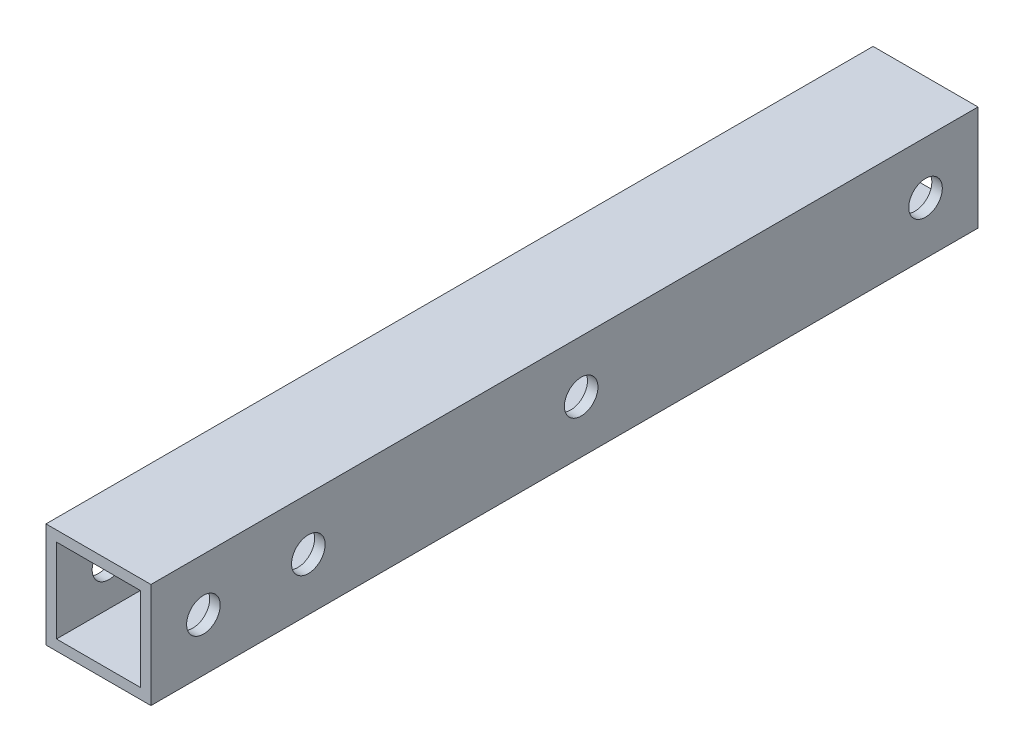
ISO-10303-21;
HEADER;
FILE_DESCRIPTION(('STEP AP214'),'2;1');
FILE_NAME('part.step','',(''),(''),'','','');
FILE_SCHEMA(('AUTOMOTIVE_DESIGN { 1 0 10303 214 1 1 1 1 }'));
ENDSEC;
DATA;
#1=APPLICATION_CONTEXT('core data for automotive mechanical design processes');
#2=APPLICATION_PROTOCOL_DEFINITION('international standard','automotive_design',2000,#1);
#3=PRODUCT_CONTEXT('',#1,'mechanical');
#4=PRODUCT('Part','Part','',(#3));
#5=PRODUCT_RELATED_PRODUCT_CATEGORY('part','',(#4));
#6=PRODUCT_DEFINITION_FORMATION('','',#4);
#7=PRODUCT_DEFINITION_CONTEXT('part definition',#1,'design');
#8=PRODUCT_DEFINITION('design','',#6,#7);
#9=PRODUCT_DEFINITION_SHAPE('','',#8);
#10=(LENGTH_UNIT() NAMED_UNIT(*) SI_UNIT(.MILLI.,.METRE.));
#11=(NAMED_UNIT(*) PLANE_ANGLE_UNIT() SI_UNIT($,.RADIAN.));
#12=(NAMED_UNIT(*) SI_UNIT($,.STERADIAN.) SOLID_ANGLE_UNIT());
#13=UNCERTAINTY_MEASURE_WITH_UNIT(LENGTH_MEASURE(1.E-05),#10,'distance_accuracy_value','');
#14=(GEOMETRIC_REPRESENTATION_CONTEXT(3) GLOBAL_UNCERTAINTY_ASSIGNED_CONTEXT((#13)) GLOBAL_UNIT_ASSIGNED_CONTEXT((#10,
#11,#12)) REPRESENTATION_CONTEXT('',''));
#15=CARTESIAN_POINT('',(0.,0.,0.));
#16=DIRECTION('',(0.,0.,1.));
#17=DIRECTION('',(1.,0.,0.));
#18=AXIS2_PLACEMENT_3D('',#15,#16,#17);
#19=CARTESIAN_POINT('',(0.,0.,78.81860214));
#20=DIRECTION('',(0.,0.,-1.));
#21=DIRECTION('',(-1.,0.,0.));
#22=AXIS2_PLACEMENT_3D('',#19,#20,#21);
#23=PLANE('',#22);
#24=DIRECTION('',(0.,1.,0.));
#25=VECTOR('',#24,1.);
#26=CARTESIAN_POINT('',(5.,-5.,78.81860214));
#27=LINE('',#26,#25);
#28=CARTESIAN_POINT('',(5.,-5.,78.81860214));
#29=VERTEX_POINT('',#28);
#30=CARTESIAN_POINT('',(5.,5.,78.81860214));
#31=VERTEX_POINT('',#30);
#32=EDGE_CURVE('E138',#29,#31,#27,.T.);
#33=ORIENTED_EDGE('',*,*,#32,.T.);
#34=DIRECTION('',(-1.,0.,0.));
#35=VECTOR('',#34,1.);
#36=CARTESIAN_POINT('',(-5.,5.,78.81860214));
#37=LINE('',#36,#35);
#38=CARTESIAN_POINT('',(-5.,5.,78.81860214));
#39=VERTEX_POINT('',#38);
#40=EDGE_CURVE('E141',#31,#39,#37,.T.);
#41=ORIENTED_EDGE('',*,*,#40,.T.);
#42=DIRECTION('',(0.,-1.,0.));
#43=VECTOR('',#42,1.);
#44=CARTESIAN_POINT('',(-5.,-5.,78.81860214));
#45=LINE('',#44,#43);
#46=CARTESIAN_POINT('',(-5.,-5.,78.81860214));
#47=VERTEX_POINT('',#46);
#48=EDGE_CURVE('E144',#39,#47,#45,.T.);
#49=ORIENTED_EDGE('',*,*,#48,.T.);
#50=DIRECTION('',(1.,0.,0.));
#51=VECTOR('',#50,1.);
#52=CARTESIAN_POINT('',(-5.,-5.,78.81860214));
#53=LINE('',#52,#51);
#54=EDGE_CURVE('E146',#47,#29,#53,.T.);
#55=ORIENTED_EDGE('',*,*,#54,.T.);
#56=EDGE_LOOP('',(#33,#41,#49,#55));
#57=FACE_BOUND('',#56,.T.);
#58=DIRECTION('',(0.,1.,0.));
#59=VECTOR('',#58,1.);
#60=CARTESIAN_POINT('',(4.,-4.,78.81860214));
#61=LINE('',#60,#59);
#62=CARTESIAN_POINT('',(4.,-4.,78.81860214));
#63=VERTEX_POINT('',#62);
#64=CARTESIAN_POINT('',(4.,4.,78.81860214));
#65=VERTEX_POINT('',#64);
#66=EDGE_CURVE('E100',#63,#65,#61,.T.);
#67=ORIENTED_EDGE('',*,*,#66,.F.);
#68=DIRECTION('',(1.,0.,0.));
#69=VECTOR('',#68,1.);
#70=CARTESIAN_POINT('',(-4.,-4.,78.81860214));
#71=LINE('',#70,#69);
#72=CARTESIAN_POINT('',(-4.,-4.,78.81860214));
#73=VERTEX_POINT('',#72);
#74=EDGE_CURVE('E122',#73,#63,#71,.T.);
#75=ORIENTED_EDGE('',*,*,#74,.F.);
#76=DIRECTION('',(0.,-1.,0.));
#77=VECTOR('',#76,1.);
#78=CARTESIAN_POINT('',(-4.,-4.,78.81860214));
#79=LINE('',#78,#77);
#80=CARTESIAN_POINT('',(-4.,4.,78.81860214));
#81=VERTEX_POINT('',#80);
#82=EDGE_CURVE('E120',#81,#73,#79,.T.);
#83=ORIENTED_EDGE('',*,*,#82,.F.);
#84=DIRECTION('',(-1.,0.,0.));
#85=VECTOR('',#84,1.);
#86=CARTESIAN_POINT('',(-4.,4.,78.81860214));
#87=LINE('',#86,#85);
#88=EDGE_CURVE('E108',#65,#81,#87,.T.);
#89=ORIENTED_EDGE('',*,*,#88,.F.);
#90=EDGE_LOOP('',(#67,#75,#83,#89));
#91=FACE_BOUND('',#90,.T.);
#92=ADVANCED_FACE('F33',(#57,#91),#23,.F.);
#93=CARTESIAN_POINT('',(0.,0.,0.));
#94=DIRECTION('',(0.,0.,-1.));
#95=DIRECTION('',(-1.,0.,0.));
#96=AXIS2_PLACEMENT_3D('',#93,#94,#95);
#97=PLANE('',#96);
#98=DIRECTION('',(0.,1.,0.));
#99=VECTOR('',#98,1.);
#100=CARTESIAN_POINT('',(5.,-5.,0.));
#101=LINE('',#100,#99);
#102=CARTESIAN_POINT('',(5.,-5.,0.));
#103=VERTEX_POINT('',#102);
#104=CARTESIAN_POINT('',(5.,5.,0.));
#105=VERTEX_POINT('',#104);
#106=EDGE_CURVE('E116',#103,#105,#101,.T.);
#107=ORIENTED_EDGE('',*,*,#106,.F.);
#108=DIRECTION('',(1.,0.,0.));
#109=VECTOR('',#108,1.);
#110=CARTESIAN_POINT('',(-5.,-5.,0.));
#111=LINE('',#110,#109);
#112=CARTESIAN_POINT('',(-5.,-5.,0.));
#113=VERTEX_POINT('',#112);
#114=EDGE_CURVE('E142',#113,#103,#111,.T.);
#115=ORIENTED_EDGE('',*,*,#114,.F.);
#116=DIRECTION('',(0.,-1.,0.));
#117=VECTOR('',#116,1.);
#118=CARTESIAN_POINT('',(-5.,-5.,0.));
#119=LINE('',#118,#117);
#120=CARTESIAN_POINT('',(-5.,5.,0.));
#121=VERTEX_POINT('',#120);
#122=EDGE_CURVE('E153',#121,#113,#119,.T.);
#123=ORIENTED_EDGE('',*,*,#122,.F.);
#124=DIRECTION('',(-1.,0.,0.));
#125=VECTOR('',#124,1.);
#126=CARTESIAN_POINT('',(-5.,5.,0.));
#127=LINE('',#126,#125);
#128=EDGE_CURVE('E151',#105,#121,#127,.T.);
#129=ORIENTED_EDGE('',*,*,#128,.F.);
#130=EDGE_LOOP('',(#107,#115,#123,#129));
#131=FACE_BOUND('',#130,.T.);
#132=DIRECTION('',(1.,0.,0.));
#133=VECTOR('',#132,1.);
#134=CARTESIAN_POINT('',(-4.,-4.,0.));
#135=LINE('',#134,#133);
#136=CARTESIAN_POINT('',(-4.,-4.,0.));
#137=VERTEX_POINT('',#136);
#138=CARTESIAN_POINT('',(4.,-4.,0.));
#139=VERTEX_POINT('',#138);
#140=EDGE_CURVE('E109',#137,#139,#135,.T.);
#141=ORIENTED_EDGE('',*,*,#140,.T.);
#142=DIRECTION('',(0.,1.,0.));
#143=VECTOR('',#142,1.);
#144=CARTESIAN_POINT('',(4.,-4.,0.));
#145=LINE('',#144,#143);
#146=CARTESIAN_POINT('',(4.,4.,0.));
#147=VERTEX_POINT('',#146);
#148=EDGE_CURVE('E58',#139,#147,#145,.T.);
#149=ORIENTED_EDGE('',*,*,#148,.T.);
#150=DIRECTION('',(-1.,0.,0.));
#151=VECTOR('',#150,1.);
#152=CARTESIAN_POINT('',(-4.,4.,0.));
#153=LINE('',#152,#151);
#154=CARTESIAN_POINT('',(-4.,4.,0.));
#155=VERTEX_POINT('',#154);
#156=EDGE_CURVE('E115',#147,#155,#153,.T.);
#157=ORIENTED_EDGE('',*,*,#156,.T.);
#158=DIRECTION('',(0.,-1.,0.));
#159=VECTOR('',#158,1.);
#160=CARTESIAN_POINT('',(-4.,-4.,0.));
#161=LINE('',#160,#159);
#162=EDGE_CURVE('E130',#155,#137,#161,.T.);
#163=ORIENTED_EDGE('',*,*,#162,.T.);
#164=EDGE_LOOP('',(#141,#149,#157,#163));
#165=FACE_BOUND('',#164,.T.);
#166=ADVANCED_FACE('F231',(#131,#165),#97,.T.);
#167=CARTESIAN_POINT('',(5.,-5.,78.81860214));
#168=DIRECTION('',(-1.,0.,0.));
#169=DIRECTION('',(0.,0.,1.));
#170=AXIS2_PLACEMENT_3D('',#167,#168,#169);
#171=PLANE('',#170);
#172=CARTESIAN_POINT('',(5.,0.,63.81860214));
#173=DIRECTION('',(-1.,0.,0.));
#174=DIRECTION('',(0.,0.,1.));
#175=AXIS2_PLACEMENT_3D('',#172,#173,#174);
#176=CIRCLE('',#175,1.60000000000001);
#177=CARTESIAN_POINT('',(5.,0.,65.41860214));
#178=VERTEX_POINT('',#177);
#179=EDGE_CURVE('E173',#178,#178,#176,.T.);
#180=ORIENTED_EDGE('',*,*,#179,.T.);
#181=EDGE_LOOP('',(#180));
#182=FACE_BOUND('',#181,.T.);
#183=CARTESIAN_POINT('',(5.,0.,37.81860214));
#184=DIRECTION('',(-1.,0.,0.));
#185=DIRECTION('',(0.,0.,1.));
#186=AXIS2_PLACEMENT_3D('',#183,#184,#185);
#187=CIRCLE('',#186,1.60000000000001);
#188=CARTESIAN_POINT('',(5.,0.,39.41860214));
#189=VERTEX_POINT('',#188);
#190=EDGE_CURVE('E184',#189,#189,#187,.T.);
#191=ORIENTED_EDGE('',*,*,#190,.T.);
#192=EDGE_LOOP('',(#191));
#193=FACE_BOUND('',#192,.T.);
#194=CARTESIAN_POINT('',(5.,0.,5.00000000000001));
#195=DIRECTION('',(1.,0.,0.));
#196=DIRECTION('',(0.,0.,-1.));
#197=AXIS2_PLACEMENT_3D('',#194,#195,#196);
#198=CIRCLE('',#197,1.6);
#199=CARTESIAN_POINT('',(5.,0.,3.40000000000001));
#200=VERTEX_POINT('',#199);
#201=EDGE_CURVE('E198',#200,#200,#198,.T.);
#202=ORIENTED_EDGE('',*,*,#201,.F.);
#203=EDGE_LOOP('',(#202));
#204=FACE_BOUND('',#203,.T.);
#205=CARTESIAN_POINT('',(5.,0.,73.81860214));
#206=DIRECTION('',(1.,0.,0.));
#207=DIRECTION('',(0.,0.,-1.));
#208=AXIS2_PLACEMENT_3D('',#205,#206,#207);
#209=CIRCLE('',#208,1.60000000000001);
#210=CARTESIAN_POINT('',(5.,0.,72.21860214));
#211=VERTEX_POINT('',#210);
#212=EDGE_CURVE('E195',#211,#211,#209,.T.);
#213=ORIENTED_EDGE('',*,*,#212,.F.);
#214=EDGE_LOOP('',(#213));
#215=FACE_BOUND('',#214,.T.);
#216=ORIENTED_EDGE('',*,*,#106,.T.);
#217=DIRECTION('',(0.,0.,-1.));
#218=VECTOR('',#217,1.);
#219=CARTESIAN_POINT('',(5.,5.,78.81860214));
#220=LINE('',#219,#218);
#221=EDGE_CURVE('E11',#31,#105,#220,.T.);
#222=ORIENTED_EDGE('',*,*,#221,.F.);
#223=ORIENTED_EDGE('',*,*,#32,.F.);
#224=DIRECTION('',(0.,0.,-1.));
#225=VECTOR('',#224,1.);
#226=CARTESIAN_POINT('',(5.,-5.,78.81860214));
#227=LINE('',#226,#225);
#228=EDGE_CURVE('E148',#29,#103,#227,.T.);
#229=ORIENTED_EDGE('',*,*,#228,.T.);
#230=EDGE_LOOP('',(#216,#222,#223,#229));
#231=FACE_BOUND('',#230,.T.);
#232=ADVANCED_FACE('F35',(#182,#193,#204,#215,#231),#171,.F.);
#233=CARTESIAN_POINT('',(-5.,5.,78.81860214));
#234=DIRECTION('',(0.,-1.,0.));
#235=DIRECTION('',(0.,0.,-1.));
#236=AXIS2_PLACEMENT_3D('',#233,#234,#235);
#237=PLANE('',#236);
#238=ORIENTED_EDGE('',*,*,#128,.T.);
#239=DIRECTION('',(0.,0.,-1.));
#240=VECTOR('',#239,1.);
#241=CARTESIAN_POINT('',(-5.,5.,78.81860214));
#242=LINE('',#241,#240);
#243=EDGE_CURVE('E42',#39,#121,#242,.T.);
#244=ORIENTED_EDGE('',*,*,#243,.F.);
#245=ORIENTED_EDGE('',*,*,#40,.F.);
#246=ORIENTED_EDGE('',*,*,#221,.T.);
#247=EDGE_LOOP('',(#238,#244,#245,#246));
#248=FACE_BOUND('',#247,.T.);
#249=ADVANCED_FACE('F230',(#248),#237,.F.);
#250=CARTESIAN_POINT('',(-5.,-5.,78.81860214));
#251=DIRECTION('',(1.,0.,0.));
#252=DIRECTION('',(0.,0.,-1.));
#253=AXIS2_PLACEMENT_3D('',#250,#251,#252);
#254=PLANE('',#253);
#255=CARTESIAN_POINT('',(-5.,0.,63.81860214));
#256=DIRECTION('',(-1.,0.,0.));
#257=DIRECTION('',(0.,0.,1.));
#258=AXIS2_PLACEMENT_3D('',#255,#256,#257);
#259=CIRCLE('',#258,1.60000000000001);
#260=CARTESIAN_POINT('',(-5.,0.,65.41860214));
#261=VERTEX_POINT('',#260);
#262=EDGE_CURVE('E179',#261,#261,#259,.T.);
#263=ORIENTED_EDGE('',*,*,#262,.F.);
#264=EDGE_LOOP('',(#263));
#265=FACE_BOUND('',#264,.T.);
#266=CARTESIAN_POINT('',(-5.,0.,37.81860214));
#267=DIRECTION('',(-1.,0.,0.));
#268=DIRECTION('',(0.,0.,1.));
#269=AXIS2_PLACEMENT_3D('',#266,#267,#268);
#270=CIRCLE('',#269,1.60000000000001);
#271=CARTESIAN_POINT('',(-5.,0.,39.41860214));
#272=VERTEX_POINT('',#271);
#273=EDGE_CURVE('E189',#272,#272,#270,.T.);
#274=ORIENTED_EDGE('',*,*,#273,.F.);
#275=EDGE_LOOP('',(#274));
#276=FACE_BOUND('',#275,.T.);
#277=CARTESIAN_POINT('',(-5.,0.,5.00000000000001));
#278=DIRECTION('',(1.,0.,0.));
#279=DIRECTION('',(0.,0.,-1.));
#280=AXIS2_PLACEMENT_3D('',#277,#278,#279);
#281=CIRCLE('',#280,1.6);
#282=CARTESIAN_POINT('',(-5.,0.,3.40000000000001));
#283=VERTEX_POINT('',#282);
#284=EDGE_CURVE('E167',#283,#283,#281,.T.);
#285=ORIENTED_EDGE('',*,*,#284,.T.);
#286=EDGE_LOOP('',(#285));
#287=FACE_BOUND('',#286,.T.);
#288=CARTESIAN_POINT('',(-5.,0.,73.81860214));
#289=DIRECTION('',(1.,0.,0.));
#290=DIRECTION('',(0.,0.,-1.));
#291=AXIS2_PLACEMENT_3D('',#288,#289,#290);
#292=CIRCLE('',#291,1.60000000000001);
#293=CARTESIAN_POINT('',(-5.,0.,72.21860214));
#294=VERTEX_POINT('',#293);
#295=EDGE_CURVE('E201',#294,#294,#292,.T.);
#296=ORIENTED_EDGE('',*,*,#295,.T.);
#297=EDGE_LOOP('',(#296));
#298=FACE_BOUND('',#297,.T.);
#299=ORIENTED_EDGE('',*,*,#122,.T.);
#300=DIRECTION('',(0.,0.,-1.));
#301=VECTOR('',#300,1.);
#302=CARTESIAN_POINT('',(-5.,-5.,78.81860214));
#303=LINE('',#302,#301);
#304=EDGE_CURVE('E158',#47,#113,#303,.T.);
#305=ORIENTED_EDGE('',*,*,#304,.F.);
#306=ORIENTED_EDGE('',*,*,#48,.F.);
#307=ORIENTED_EDGE('',*,*,#243,.T.);
#308=EDGE_LOOP('',(#299,#305,#306,#307));
#309=FACE_BOUND('',#308,.T.);
#310=ADVANCED_FACE('F248',(#265,#276,#287,#298,#309),#254,.F.);
#311=CARTESIAN_POINT('',(-5.,-5.,78.81860214));
#312=DIRECTION('',(0.,1.,0.));
#313=DIRECTION('',(0.,0.,1.));
#314=AXIS2_PLACEMENT_3D('',#311,#312,#313);
#315=PLANE('',#314);
#316=ORIENTED_EDGE('',*,*,#114,.T.);
#317=ORIENTED_EDGE('',*,*,#228,.F.);
#318=ORIENTED_EDGE('',*,*,#54,.F.);
#319=ORIENTED_EDGE('',*,*,#304,.T.);
#320=EDGE_LOOP('',(#316,#317,#318,#319));
#321=FACE_BOUND('',#320,.T.);
#322=ADVANCED_FACE('F215',(#321),#315,.F.);
#323=CARTESIAN_POINT('',(4.,-4.,78.81860214));
#324=DIRECTION('',(-1.,0.,0.));
#325=DIRECTION('',(0.,0.,1.));
#326=AXIS2_PLACEMENT_3D('',#323,#324,#325);
#327=PLANE('',#326);
#328=CARTESIAN_POINT('',(4.,0.,63.81860214));
#329=DIRECTION('',(-1.,0.,0.));
#330=DIRECTION('',(0.,0.,1.));
#331=AXIS2_PLACEMENT_3D('',#328,#329,#330);
#332=CIRCLE('',#331,1.60000000000001);
#333=CARTESIAN_POINT('',(4.,0.,65.41860214));
#334=VERTEX_POINT('',#333);
#335=EDGE_CURVE('E192',#334,#334,#332,.T.);
#336=ORIENTED_EDGE('',*,*,#335,.F.);
#337=EDGE_LOOP('',(#336));
#338=FACE_BOUND('',#337,.T.);
#339=CARTESIAN_POINT('',(4.,0.,37.81860214));
#340=DIRECTION('',(-1.,0.,0.));
#341=DIRECTION('',(0.,0.,1.));
#342=AXIS2_PLACEMENT_3D('',#339,#340,#341);
#343=CIRCLE('',#342,1.60000000000001);
#344=CARTESIAN_POINT('',(4.,0.,39.41860214));
#345=VERTEX_POINT('',#344);
#346=EDGE_CURVE('E172',#345,#345,#343,.T.);
#347=ORIENTED_EDGE('',*,*,#346,.F.);
#348=EDGE_LOOP('',(#347));
#349=FACE_BOUND('',#348,.T.);
#350=CARTESIAN_POINT('',(4.,0.,5.00000000000001));
#351=DIRECTION('',(-1.,0.,0.));
#352=DIRECTION('',(0.,0.,1.));
#353=AXIS2_PLACEMENT_3D('',#350,#351,#352);
#354=CIRCLE('',#353,1.6);
#355=CARTESIAN_POINT('',(4.,0.,6.60000000000001));
#356=VERTEX_POINT('',#355);
#357=EDGE_CURVE('E128',#356,#356,#354,.T.);
#358=ORIENTED_EDGE('',*,*,#357,.F.);
#359=EDGE_LOOP('',(#358));
#360=FACE_BOUND('',#359,.T.);
#361=CARTESIAN_POINT('',(4.,0.,73.81860214));
#362=DIRECTION('',(-1.,0.,0.));
#363=DIRECTION('',(0.,0.,1.));
#364=AXIS2_PLACEMENT_3D('',#361,#362,#363);
#365=CIRCLE('',#364,1.60000000000001);
#366=CARTESIAN_POINT('',(4.,0.,75.41860214));
#367=VERTEX_POINT('',#366);
#368=EDGE_CURVE('E166',#367,#367,#365,.T.);
#369=ORIENTED_EDGE('',*,*,#368,.F.);
#370=EDGE_LOOP('',(#369));
#371=FACE_BOUND('',#370,.T.);
#372=ORIENTED_EDGE('',*,*,#148,.F.);
#373=DIRECTION('',(0.,0.,-1.));
#374=VECTOR('',#373,1.);
#375=CARTESIAN_POINT('',(4.,-4.,78.81860214));
#376=LINE('',#375,#374);
#377=EDGE_CURVE('E104',#63,#139,#376,.T.);
#378=ORIENTED_EDGE('',*,*,#377,.F.);
#379=ORIENTED_EDGE('',*,*,#66,.T.);
#380=DIRECTION('',(0.,0.,-1.));
#381=VECTOR('',#380,1.);
#382=CARTESIAN_POINT('',(4.,4.,78.81860214));
#383=LINE('',#382,#381);
#384=EDGE_CURVE('E103',#65,#147,#383,.T.);
#385=ORIENTED_EDGE('',*,*,#384,.T.);
#386=EDGE_LOOP('',(#372,#378,#379,#385));
#387=FACE_BOUND('',#386,.T.);
#388=ADVANCED_FACE('F102',(#338,#349,#360,#371,#387),#327,.T.);
#389=CARTESIAN_POINT('',(-4.,4.,78.81860214));
#390=DIRECTION('',(0.,-1.,0.));
#391=DIRECTION('',(0.,0.,-1.));
#392=AXIS2_PLACEMENT_3D('',#389,#390,#391);
#393=PLANE('',#392);
#394=ORIENTED_EDGE('',*,*,#156,.F.);
#395=ORIENTED_EDGE('',*,*,#384,.F.);
#396=ORIENTED_EDGE('',*,*,#88,.T.);
#397=DIRECTION('',(0.,0.,-1.));
#398=VECTOR('',#397,1.);
#399=CARTESIAN_POINT('',(-4.,4.,78.81860214));
#400=LINE('',#399,#398);
#401=EDGE_CURVE('E117',#81,#155,#400,.T.);
#402=ORIENTED_EDGE('',*,*,#401,.T.);
#403=EDGE_LOOP('',(#394,#395,#396,#402));
#404=FACE_BOUND('',#403,.T.);
#405=ADVANCED_FACE('F112',(#404),#393,.T.);
#406=CARTESIAN_POINT('',(-4.,-4.,78.81860214));
#407=DIRECTION('',(1.,0.,0.));
#408=DIRECTION('',(0.,0.,-1.));
#409=AXIS2_PLACEMENT_3D('',#406,#407,#408);
#410=PLANE('',#409);
#411=CARTESIAN_POINT('',(-4.,0.,63.81860214));
#412=DIRECTION('',(1.,0.,0.));
#413=DIRECTION('',(0.,0.,-1.));
#414=AXIS2_PLACEMENT_3D('',#411,#412,#413);
#415=CIRCLE('',#414,1.60000000000001);
#416=CARTESIAN_POINT('',(-4.,0.,62.21860214));
#417=VERTEX_POINT('',#416);
#418=EDGE_CURVE('E37',#417,#417,#415,.T.);
#419=ORIENTED_EDGE('',*,*,#418,.F.);
#420=EDGE_LOOP('',(#419));
#421=FACE_BOUND('',#420,.T.);
#422=CARTESIAN_POINT('',(-4.,0.,37.81860214));
#423=DIRECTION('',(1.,0.,0.));
#424=DIRECTION('',(0.,0.,-1.));
#425=AXIS2_PLACEMENT_3D('',#422,#423,#424);
#426=CIRCLE('',#425,1.60000000000001);
#427=CARTESIAN_POINT('',(-4.,0.,36.21860214));
#428=VERTEX_POINT('',#427);
#429=EDGE_CURVE('E170',#428,#428,#426,.T.);
#430=ORIENTED_EDGE('',*,*,#429,.F.);
#431=EDGE_LOOP('',(#430));
#432=FACE_BOUND('',#431,.T.);
#433=CARTESIAN_POINT('',(-4.,0.,5.00000000000001));
#434=DIRECTION('',(1.,0.,0.));
#435=DIRECTION('',(0.,0.,-1.));
#436=AXIS2_PLACEMENT_3D('',#433,#434,#435);
#437=CIRCLE('',#436,1.6);
#438=CARTESIAN_POINT('',(-4.,0.,3.40000000000001));
#439=VERTEX_POINT('',#438);
#440=EDGE_CURVE('E168',#439,#439,#437,.T.);
#441=ORIENTED_EDGE('',*,*,#440,.F.);
#442=EDGE_LOOP('',(#441));
#443=FACE_BOUND('',#442,.T.);
#444=CARTESIAN_POINT('',(-4.,0.,73.81860214));
#445=DIRECTION('',(1.,0.,0.));
#446=DIRECTION('',(0.,0.,-1.));
#447=AXIS2_PLACEMENT_3D('',#444,#445,#446);
#448=CIRCLE('',#447,1.60000000000001);
#449=CARTESIAN_POINT('',(-4.,0.,72.21860214));
#450=VERTEX_POINT('',#449);
#451=EDGE_CURVE('E163',#450,#450,#448,.T.);
#452=ORIENTED_EDGE('',*,*,#451,.F.);
#453=EDGE_LOOP('',(#452));
#454=FACE_BOUND('',#453,.T.);
#455=ORIENTED_EDGE('',*,*,#162,.F.);
#456=ORIENTED_EDGE('',*,*,#401,.F.);
#457=ORIENTED_EDGE('',*,*,#82,.T.);
#458=DIRECTION('',(0.,0.,-1.));
#459=VECTOR('',#458,1.);
#460=CARTESIAN_POINT('',(-4.,-4.,78.81860214));
#461=LINE('',#460,#459);
#462=EDGE_CURVE('E50',#73,#137,#461,.T.);
#463=ORIENTED_EDGE('',*,*,#462,.T.);
#464=EDGE_LOOP('',(#455,#456,#457,#463));
#465=FACE_BOUND('',#464,.T.);
#466=ADVANCED_FACE('F268',(#421,#432,#443,#454,#465),#410,.T.);
#467=CARTESIAN_POINT('',(-4.,-4.,78.81860214));
#468=DIRECTION('',(0.,1.,0.));
#469=DIRECTION('',(0.,0.,1.));
#470=AXIS2_PLACEMENT_3D('',#467,#468,#469);
#471=PLANE('',#470);
#472=ORIENTED_EDGE('',*,*,#140,.F.);
#473=ORIENTED_EDGE('',*,*,#462,.F.);
#474=ORIENTED_EDGE('',*,*,#74,.T.);
#475=ORIENTED_EDGE('',*,*,#377,.T.);
#476=EDGE_LOOP('',(#472,#473,#474,#475));
#477=FACE_BOUND('',#476,.T.);
#478=ADVANCED_FACE('F271',(#477),#471,.T.);
#479=CARTESIAN_POINT('',(-5.,0.,73.81860214));
#480=DIRECTION('',(1.,0.,0.));
#481=DIRECTION('',(0.,0.,-1.));
#482=AXIS2_PLACEMENT_3D('',#479,#480,#481);
#483=CYLINDRICAL_SURFACE('',#482,1.60000000000001);
#484=ORIENTED_EDGE('',*,*,#451,.T.);
#485=EDGE_LOOP('',(#484));
#486=FACE_BOUND('',#485,.T.);
#487=ORIENTED_EDGE('',*,*,#295,.F.);
#488=EDGE_LOOP('',(#487));
#489=FACE_BOUND('',#488,.T.);
#490=ADVANCED_FACE('F225',(#486,#489),#483,.F.);
#491=CARTESIAN_POINT('',(-5.,0.,5.00000000000001));
#492=DIRECTION('',(1.,0.,0.));
#493=DIRECTION('',(0.,0.,-1.));
#494=AXIS2_PLACEMENT_3D('',#491,#492,#493);
#495=CYLINDRICAL_SURFACE('',#494,1.6);
#496=ORIENTED_EDGE('',*,*,#440,.T.);
#497=EDGE_LOOP('',(#496));
#498=FACE_BOUND('',#497,.T.);
#499=ORIENTED_EDGE('',*,*,#284,.F.);
#500=EDGE_LOOP('',(#499));
#501=FACE_BOUND('',#500,.T.);
#502=ADVANCED_FACE('F223',(#498,#501),#495,.F.);
#503=ORIENTED_EDGE('',*,*,#368,.T.);
#504=EDGE_LOOP('',(#503));
#505=FACE_BOUND('',#504,.T.);
#506=ORIENTED_EDGE('',*,*,#212,.T.);
#507=EDGE_LOOP('',(#506));
#508=FACE_BOUND('',#507,.T.);
#509=ADVANCED_FACE('F220',(#505,#508),#483,.F.);
#510=ORIENTED_EDGE('',*,*,#357,.T.);
#511=EDGE_LOOP('',(#510));
#512=FACE_BOUND('',#511,.T.);
#513=ORIENTED_EDGE('',*,*,#201,.T.);
#514=EDGE_LOOP('',(#513));
#515=FACE_BOUND('',#514,.T.);
#516=ADVANCED_FACE('F210',(#512,#515),#495,.F.);
#517=CARTESIAN_POINT('',(5.,0.,37.81860214));
#518=DIRECTION('',(-1.,0.,0.));
#519=DIRECTION('',(0.,0.,1.));
#520=AXIS2_PLACEMENT_3D('',#517,#518,#519);
#521=CYLINDRICAL_SURFACE('',#520,1.60000000000001);
#522=ORIENTED_EDGE('',*,*,#429,.T.);
#523=EDGE_LOOP('',(#522));
#524=FACE_BOUND('',#523,.T.);
#525=ORIENTED_EDGE('',*,*,#273,.T.);
#526=EDGE_LOOP('',(#525));
#527=FACE_BOUND('',#526,.T.);
#528=ADVANCED_FACE('F280',(#524,#527),#521,.F.);
#529=CARTESIAN_POINT('',(5.,0.,63.81860214));
#530=DIRECTION('',(-1.,0.,0.));
#531=DIRECTION('',(0.,0.,1.));
#532=AXIS2_PLACEMENT_3D('',#529,#530,#531);
#533=CYLINDRICAL_SURFACE('',#532,1.60000000000001);
#534=ORIENTED_EDGE('',*,*,#418,.T.);
#535=EDGE_LOOP('',(#534));
#536=FACE_BOUND('',#535,.T.);
#537=ORIENTED_EDGE('',*,*,#262,.T.);
#538=EDGE_LOOP('',(#537));
#539=FACE_BOUND('',#538,.T.);
#540=ADVANCED_FACE('F283',(#536,#539),#533,.F.);
#541=ORIENTED_EDGE('',*,*,#346,.T.);
#542=EDGE_LOOP('',(#541));
#543=FACE_BOUND('',#542,.T.);
#544=ORIENTED_EDGE('',*,*,#190,.F.);
#545=EDGE_LOOP('',(#544));
#546=FACE_BOUND('',#545,.T.);
#547=ADVANCED_FACE('F284',(#543,#546),#521,.F.);
#548=ORIENTED_EDGE('',*,*,#335,.T.);
#549=EDGE_LOOP('',(#548));
#550=FACE_BOUND('',#549,.T.);
#551=ORIENTED_EDGE('',*,*,#179,.F.);
#552=EDGE_LOOP('',(#551));
#553=FACE_BOUND('',#552,.T.);
#554=ADVANCED_FACE('F287',(#550,#553),#533,.F.);
#555=CLOSED_SHELL('',(#92,#166,#232,#249,#310,#322,#388,#405,#466,#478,#490,#502,#509,#516,#528,
#540,#547,#554));
#556=MANIFOLD_SOLID_BREP('B2',#555);
#557=ADVANCED_BREP_SHAPE_REPRESENTATION('',(#18,#556),#14);
#558=SHAPE_DEFINITION_REPRESENTATION(#9,#557);
ENDSEC;
END-ISO-10303-21;
